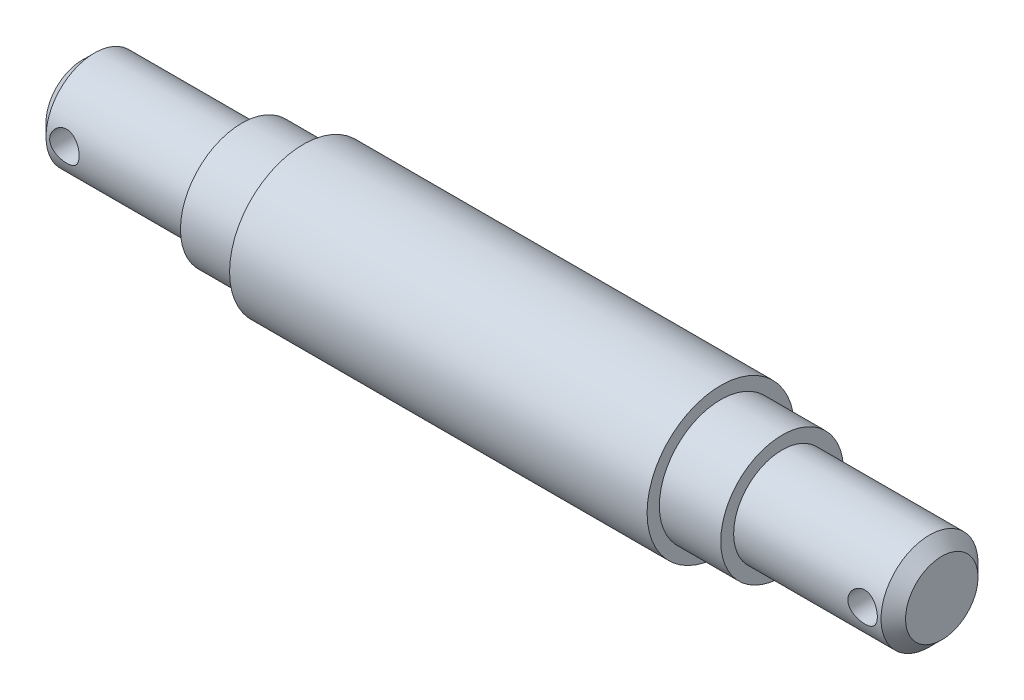
ISO-10303-21;
HEADER;
FILE_DESCRIPTION(('STEP AP214'),'2;1');
FILE_NAME('part.step','',(''),(''),'','','');
FILE_SCHEMA(('AUTOMOTIVE_DESIGN { 1 0 10303 214 1 1 1 1 }'));
ENDSEC;
DATA;
#1=APPLICATION_CONTEXT('core data for automotive mechanical design processes');
#2=APPLICATION_PROTOCOL_DEFINITION('international standard','automotive_design',2000,#1);
#3=PRODUCT_CONTEXT('',#1,'mechanical');
#4=PRODUCT('Part','Part','',(#3));
#5=PRODUCT_RELATED_PRODUCT_CATEGORY('part','',(#4));
#6=PRODUCT_DEFINITION_FORMATION('','',#4);
#7=PRODUCT_DEFINITION_CONTEXT('part definition',#1,'design');
#8=PRODUCT_DEFINITION('design','',#6,#7);
#9=PRODUCT_DEFINITION_SHAPE('','',#8);
#10=(LENGTH_UNIT() NAMED_UNIT(*) SI_UNIT(.MILLI.,.METRE.));
#11=(NAMED_UNIT(*) PLANE_ANGLE_UNIT() SI_UNIT($,.RADIAN.));
#12=(NAMED_UNIT(*) SI_UNIT($,.STERADIAN.) SOLID_ANGLE_UNIT());
#13=UNCERTAINTY_MEASURE_WITH_UNIT(LENGTH_MEASURE(1.E-05),#10,'distance_accuracy_value','');
#14=(GEOMETRIC_REPRESENTATION_CONTEXT(3) GLOBAL_UNCERTAINTY_ASSIGNED_CONTEXT((#13)) GLOBAL_UNIT_ASSIGNED_CONTEXT((#10,
#11,#12)) REPRESENTATION_CONTEXT('',''));
#15=CARTESIAN_POINT('',(0.,0.,0.));
#16=DIRECTION('',(0.,0.,1.));
#17=DIRECTION('',(1.,0.,0.));
#18=AXIS2_PLACEMENT_3D('',#15,#16,#17);
#19=CARTESIAN_POINT('',(0.,2.94999999999999,0.));
#20=DIRECTION('',(1.,0.,0.));
#21=DIRECTION('',(0.,0.,-1.));
#22=AXIS2_PLACEMENT_3D('',#19,#20,#21);
#23=PLANE('',#22);
#24=CARTESIAN_POINT('',(0.,0.,0.));
#25=DIRECTION('',(-1.,0.,0.));
#26=DIRECTION('',(0.,0.,1.));
#27=AXIS2_PLACEMENT_3D('',#24,#25,#26);
#28=CIRCLE('',#27,2.94999999999999);
#29=CARTESIAN_POINT('',(0.,0.,2.94999999999999));
#30=VERTEX_POINT('',#29);
#31=EDGE_CURVE('E121',#30,#30,#28,.T.);
#32=ORIENTED_EDGE('',*,*,#31,.T.);
#33=EDGE_LOOP('',(#32));
#34=FACE_BOUND('',#33,.T.);
#35=ADVANCED_FACE('F41',(#34),#23,.F.);
#36=CARTESIAN_POINT('',(70.,0.,0.));
#37=DIRECTION('',(-1.,0.,0.));
#38=DIRECTION('',(0.,0.,1.));
#39=AXIS2_PLACEMENT_3D('',#36,#37,#38);
#40=PLANE('',#39);
#41=CARTESIAN_POINT('',(70.,0.,0.));
#42=DIRECTION('',(-1.,0.,0.));
#43=DIRECTION('',(0.,0.,1.));
#44=AXIS2_PLACEMENT_3D('',#41,#42,#43);
#45=CIRCLE('',#44,2.95);
#46=CARTESIAN_POINT('',(70.,0.,2.95));
#47=VERTEX_POINT('',#46);
#48=EDGE_CURVE('E10',#47,#47,#45,.T.);
#49=ORIENTED_EDGE('',*,*,#48,.F.);
#50=EDGE_LOOP('',(#49));
#51=FACE_BOUND('',#50,.T.);
#52=ADVANCED_FACE('F109',(#51),#40,.F.);
#53=CARTESIAN_POINT('',(70.,0.,0.));
#54=DIRECTION('',(-1.,0.,0.));
#55=DIRECTION('',(0.,0.,1.));
#56=AXIS2_PLACEMENT_3D('',#53,#54,#55);
#57=CONICAL_SURFACE('',#56,2.95,0.785398163397448);
#58=CARTESIAN_POINT('',(69.,0.,0.));
#59=DIRECTION('',(-1.,0.,0.));
#60=DIRECTION('',(0.,0.,1.));
#61=AXIS2_PLACEMENT_3D('',#58,#59,#60);
#62=CIRCLE('',#61,3.95);
#63=CARTESIAN_POINT('',(69.,0.,3.95));
#64=VERTEX_POINT('',#63);
#65=EDGE_CURVE('E54',#64,#64,#62,.T.);
#66=ORIENTED_EDGE('',*,*,#65,.F.);
#67=EDGE_LOOP('',(#66));
#68=FACE_BOUND('',#67,.T.);
#69=ORIENTED_EDGE('',*,*,#48,.T.);
#70=EDGE_LOOP('',(#69));
#71=FACE_BOUND('',#70,.T.);
#72=ADVANCED_FACE('F104',(#68,#71),#57,.T.);
#73=CARTESIAN_POINT('',(0.,0.,0.));
#74=DIRECTION('',(-1.,0.,0.));
#75=DIRECTION('',(0.,0.,1.));
#76=AXIS2_PLACEMENT_3D('',#73,#74,#75);
#77=CYLINDRICAL_SURFACE('',#76,3.95);
#78=CARTESIAN_POINT('',(68.7,0.,3.95));
#79=CARTESIAN_POINT('',(68.699999309067,-0.0657921053393096,3.94999950148961));
#80=CARTESIAN_POINT('',(68.6945713423082,-0.131591214838203,3.94834057311497));
#81=CARTESIAN_POINT('',(68.6730560327882,-0.261270865350392,3.94188498697175));
#82=CARTESIAN_POINT('',(68.6569657419196,-0.325150870627958,3.93708746139313));
#83=CARTESIAN_POINT('',(68.6147143702164,-0.449103270402122,3.92487988296748));
#84=CARTESIAN_POINT('',(68.5885683676363,-0.509181209664437,3.91747374305666));
#85=CARTESIAN_POINT('',(68.5270102908556,-0.624100282433899,3.90081718663398));
#86=CARTESIAN_POINT('',(68.4915969145227,-0.678940678549645,3.89156651099519));
#87=CARTESIAN_POINT('',(68.4114139294501,-0.783438437222784,3.87190239177238));
#88=CARTESIAN_POINT('',(68.3664216080813,-0.832920325244443,3.86146466337096));
#89=CARTESIAN_POINT('',(68.2688324305187,-0.923765255505192,3.84074643294284));
#90=CARTESIAN_POINT('',(68.2162342575259,-0.965126888957126,3.83046595848297));
#91=CARTESIAN_POINT('',(68.1034313998918,-1.03948900030353,3.81096820781043));
#92=CARTESIAN_POINT('',(68.0430788331166,-1.07227379069014,3.80178104820254));
#93=CARTESIAN_POINT('',(67.9173927923664,-1.12715664878845,3.78587377700204));
#94=CARTESIAN_POINT('',(67.8520605536529,-1.14925735687915,3.77915305597243));
#95=CARTESIAN_POINT('',(67.7202430842059,-1.18150913793118,3.76919296296908));
#96=CARTESIAN_POINT('',(67.6538444632701,-1.19198431895655,3.76585939822971));
#97=CARTESIAN_POINT('',(67.5201549851538,-1.20169991107967,3.76277100880303));
#98=CARTESIAN_POINT('',(67.4528643545652,-1.20094312272632,3.76301529202458));
#99=CARTESIAN_POINT('',(67.3219501570623,-1.1884705081571,3.76697161773738));
#100=CARTESIAN_POINT('',(67.2582831860542,-1.17716250700933,3.7705546058486));
#101=CARTESIAN_POINT('',(67.1337964711495,-1.14456806673587,3.78057558453502));
#102=CARTESIAN_POINT('',(67.0729770153932,-1.12328062017983,3.7870138633498));
#103=CARTESIAN_POINT('',(66.9549220552885,-1.07103490290146,3.80212175360936));
#104=CARTESIAN_POINT('',(66.8977485195439,-1.03994563160966,3.81082129239325));
#105=CARTESIAN_POINT('',(66.7892941375805,-0.969069803090077,3.82945730084039));
#106=CARTESIAN_POINT('',(66.7380147553671,-0.929281092164124,3.8393940765405));
#107=CARTESIAN_POINT('',(66.6404934453549,-0.840117660833644,3.85990662941459));
#108=CARTESIAN_POINT('',(66.594561848265,-0.790405027053219,3.87049153542939));
#109=CARTESIAN_POINT('',(66.5116141422669,-0.683850928056176,3.8907306221033));
#110=CARTESIAN_POINT('',(66.474598623408,-0.627008991414062,3.90038474113935));
#111=CARTESIAN_POINT('',(66.4103388738867,-0.507235607809575,3.91776652995739));
#112=CARTESIAN_POINT('',(66.3831650382018,-0.444264225815952,3.92548020503653));
#113=CARTESIAN_POINT('',(66.3398862787667,-0.314356032727516,3.93801108754001));
#114=CARTESIAN_POINT('',(66.3237781858395,-0.247420362956473,3.94282912421219));
#115=CARTESIAN_POINT('',(66.3036084028364,-0.114120636053963,3.94889402423303));
#116=CARTESIAN_POINT('',(66.2991262681458,-0.0478257706931099,3.95026547137128));
#117=CARTESIAN_POINT('',(66.3011550878346,0.0845739664892645,3.94964905795108));
#118=CARTESIAN_POINT('',(66.3076645335288,0.150678863138067,3.94766165842204));
#119=CARTESIAN_POINT('',(66.3311524846441,0.279224843718509,3.94063250926792));
#120=CARTESIAN_POINT('',(66.3478839633591,0.341715383064576,3.93566287748284));
#121=CARTESIAN_POINT('',(66.3910425635287,0.46298751214422,3.9232462867588));
#122=CARTESIAN_POINT('',(66.4174708608141,0.521768651064515,3.91579902739437));
#123=CARTESIAN_POINT('',(66.4799699305355,0.635489778460965,3.89897895098375));
#124=CARTESIAN_POINT('',(66.5162528662978,0.690306912058737,3.88956496603778));
#125=CARTESIAN_POINT('',(66.5971744514623,0.793217107200196,3.86989097410411));
#126=CARTESIAN_POINT('',(66.6418152473686,0.841308435836415,3.85963075016098));
#127=CARTESIAN_POINT('',(66.7401615057773,0.93126219472894,3.8389403158374));
#128=CARTESIAN_POINT('',(66.7941430083754,0.972825315903959,3.82851804368209));
#129=CARTESIAN_POINT('',(66.9085410089933,1.04632580306949,3.8090881755083));
#130=CARTESIAN_POINT('',(66.9689573565118,1.07826339411975,3.80008054641565));
#131=CARTESIAN_POINT('',(67.0943366498449,1.13139313809661,3.78460257028509));
#132=CARTESIAN_POINT('',(67.1592778979753,1.15263302867236,3.77812098085674));
#133=CARTESIAN_POINT('',(67.2920499847157,1.18380847718295,3.76847037643667));
#134=CARTESIAN_POINT('',(67.3598797919581,1.1937480353996,3.76530018925136));
#135=CARTESIAN_POINT('',(67.4933883668788,1.20176405179564,3.76274882724403));
#136=CARTESIAN_POINT('',(67.559035178016,1.20032934218194,3.76321151382289));
#137=CARTESIAN_POINT('',(67.6891050998603,1.18680835860972,3.76749719259433));
#138=CARTESIAN_POINT('',(67.7535282618118,1.17472253171075,3.77132004375065));
#139=CARTESIAN_POINT('',(67.8785005993841,1.14056150948796,3.78178924861813));
#140=CARTESIAN_POINT('',(67.9390893895407,1.11861887679372,3.7883980639779));
#141=CARTESIAN_POINT('',(68.0557739216337,1.06547063438702,3.80368682812306));
#142=CARTESIAN_POINT('',(68.1118687842014,1.03426321734227,3.81236718094976));
#143=CARTESIAN_POINT('',(68.2202335502225,0.962110752635529,3.83122441855044));
#144=CARTESIAN_POINT('',(68.2722831917953,0.920846329538665,3.84144499898209));
#145=CARTESIAN_POINT('',(68.3688776312579,0.830322181374974,3.86202232713825));
#146=CARTESIAN_POINT('',(68.4134204581551,0.781060363153478,3.872379109857));
#147=CARTESIAN_POINT('',(68.4950812638234,0.674145848788934,3.89243751616363));
#148=CARTESIAN_POINT('',(68.5319339365529,0.61628443568486,3.90210985106116));
#149=CARTESIAN_POINT('',(68.5953376113773,0.494893212202996,3.91935319911683));
#150=CARTESIAN_POINT('',(68.6218932042363,0.431365943417147,3.92692514826385));
#151=CARTESIAN_POINT('',(68.6617030372843,0.307034616834357,3.93849330935894));
#152=CARTESIAN_POINT('',(68.6760247532901,0.246597141950737,3.94277212268363));
#153=CARTESIAN_POINT('',(68.6951727192245,0.124108329921254,3.94852545465588));
#154=CARTESIAN_POINT('',(68.7000006517108,0.062057280720298,3.95000047021142));
#155=CARTESIAN_POINT('',(68.7,0.,3.95));
#156=B_SPLINE_CURVE_WITH_KNOTS('',3,(#78,#79,#80,#81,#82,#83,#84,#85,#86,#87,#88,#89,#90,#91,
#92,#93,#94,#95,#96,#97,#98,#99,#100,#101,#102,#103,#104,#105,#106,#107,#108,#109,#110,#111,
#112,#113,#114,#115,#116,#117,#118,#119,#120,#121,#122,#123,#124,#125,#126,#127,#128,#129,#130,
#131,#132,#133,#134,#135,#136,#137,#138,#139,#140,#141,#142,#143,#144,#145,#146,#147,#148,#149,
#150,#151,#152,#153,#154,#155),.UNSPECIFIED.,.T.,.F.,(4,2,2,2,2,2,2,2,2,2,2,2,2,2,2,2,2,2,2,2,2,
2,2,2,2,2,2,2,2,2,2,2,2,2,2,2,2,2,4),(0.,0.197148320035393,0.394351173873383,0.591259473294277,
0.788195454606485,0.990340802366868,1.19252118949644,1.3993812680836,1.60619019875129,
1.80707614853398,2.00791201079834,2.20129315930618,2.39469383394965,2.59079745889569,
2.78694968780097,2.99151370492323,3.19609125598954,3.40210447220442,3.6080586625695,
3.80645362401528,4.00482135632748,4.19857515486445,4.39235245564506,4.59068721838334,
4.78907298841319,4.9948598043899,5.20064180838011,5.40549720473314,5.61028006032374,
5.80631124083041,6.00233419370825,6.1957963245016,6.3892962198399,6.59000270555275,
6.790761807026,6.99759277849253,7.20433143185223,7.39032118612839,7.57627797496915),.UNSPECIFIED.);
#157=CARTESIAN_POINT('',(68.7,0.,3.95));
#158=VERTEX_POINT('',#157);
#159=EDGE_CURVE('E44',#158,#158,#156,.T.);
#160=ORIENTED_EDGE('',*,*,#159,.T.);
#161=EDGE_LOOP('',(#160));
#162=FACE_BOUND('',#161,.T.);
#163=CARTESIAN_POINT('',(68.7,0.,-3.95));
#164=CARTESIAN_POINT('',(68.699999309067,0.0657921053393096,-3.94999950148961));
#165=CARTESIAN_POINT('',(68.6945713423082,0.131591214838203,-3.94834057311497));
#166=CARTESIAN_POINT('',(68.6730560327882,0.261270865350392,-3.94188498697175));
#167=CARTESIAN_POINT('',(68.6569657419196,0.325150870627958,-3.93708746139313));
#168=CARTESIAN_POINT('',(68.6147143702164,0.449103270402122,-3.92487988296748));
#169=CARTESIAN_POINT('',(68.5885683676363,0.509181209664437,-3.91747374305666));
#170=CARTESIAN_POINT('',(68.5270102908556,0.624100282433899,-3.90081718663398));
#171=CARTESIAN_POINT('',(68.4915969145227,0.678940678549645,-3.89156651099519));
#172=CARTESIAN_POINT('',(68.4114139294501,0.783438437222784,-3.87190239177238));
#173=CARTESIAN_POINT('',(68.3664216080813,0.832920325244443,-3.86146466337096));
#174=CARTESIAN_POINT('',(68.2688324305187,0.923765255505192,-3.84074643294284));
#175=CARTESIAN_POINT('',(68.2162342575259,0.965126888957126,-3.83046595848297));
#176=CARTESIAN_POINT('',(68.1034313998918,1.03948900030353,-3.81096820781043));
#177=CARTESIAN_POINT('',(68.0430788331166,1.07227379069014,-3.80178104820254));
#178=CARTESIAN_POINT('',(67.9173927923664,1.12715664878845,-3.78587377700204));
#179=CARTESIAN_POINT('',(67.8520605536529,1.14925735687915,-3.77915305597243));
#180=CARTESIAN_POINT('',(67.7202430842059,1.18150913793118,-3.76919296296908));
#181=CARTESIAN_POINT('',(67.6538444632701,1.19198431895655,-3.76585939822971));
#182=CARTESIAN_POINT('',(67.5201549851538,1.20169991107967,-3.76277100880303));
#183=CARTESIAN_POINT('',(67.4528643545652,1.20094312272632,-3.76301529202458));
#184=CARTESIAN_POINT('',(67.3219501570623,1.1884705081571,-3.76697161773738));
#185=CARTESIAN_POINT('',(67.2582831860542,1.17716250700933,-3.7705546058486));
#186=CARTESIAN_POINT('',(67.1337964711495,1.14456806673587,-3.78057558453502));
#187=CARTESIAN_POINT('',(67.0729770153932,1.12328062017983,-3.7870138633498));
#188=CARTESIAN_POINT('',(66.9549220552885,1.07103490290146,-3.80212175360936));
#189=CARTESIAN_POINT('',(66.8977485195439,1.03994563160966,-3.81082129239325));
#190=CARTESIAN_POINT('',(66.7892941375805,0.969069803090077,-3.82945730084039));
#191=CARTESIAN_POINT('',(66.7380147553671,0.929281092164124,-3.8393940765405));
#192=CARTESIAN_POINT('',(66.6404934453549,0.840117660833644,-3.85990662941459));
#193=CARTESIAN_POINT('',(66.594561848265,0.790405027053219,-3.87049153542939));
#194=CARTESIAN_POINT('',(66.5116141422669,0.683850928056176,-3.8907306221033));
#195=CARTESIAN_POINT('',(66.474598623408,0.627008991414062,-3.90038474113935));
#196=CARTESIAN_POINT('',(66.4103388738867,0.507235607809575,-3.91776652995739));
#197=CARTESIAN_POINT('',(66.3831650382018,0.444264225815952,-3.92548020503653));
#198=CARTESIAN_POINT('',(66.3398862787667,0.314356032727516,-3.93801108754001));
#199=CARTESIAN_POINT('',(66.3237781858395,0.247420362956473,-3.94282912421219));
#200=CARTESIAN_POINT('',(66.3036084028364,0.114120636053963,-3.94889402423303));
#201=CARTESIAN_POINT('',(66.2991262681458,0.0478257706931099,-3.95026547137128));
#202=CARTESIAN_POINT('',(66.3011550878346,-0.0845739664892645,-3.94964905795108));
#203=CARTESIAN_POINT('',(66.3076645335288,-0.150678863138067,-3.94766165842204));
#204=CARTESIAN_POINT('',(66.3311524846441,-0.279224843718509,-3.94063250926792));
#205=CARTESIAN_POINT('',(66.3478839633591,-0.341715383064576,-3.93566287748284));
#206=CARTESIAN_POINT('',(66.3910425635287,-0.46298751214422,-3.9232462867588));
#207=CARTESIAN_POINT('',(66.4174708608141,-0.521768651064515,-3.91579902739437));
#208=CARTESIAN_POINT('',(66.4799699305355,-0.635489778460965,-3.89897895098375));
#209=CARTESIAN_POINT('',(66.5162528662978,-0.690306912058737,-3.88956496603778));
#210=CARTESIAN_POINT('',(66.5971744514623,-0.793217107200196,-3.86989097410411));
#211=CARTESIAN_POINT('',(66.6418152473686,-0.841308435836415,-3.85963075016098));
#212=CARTESIAN_POINT('',(66.7401615057773,-0.93126219472894,-3.8389403158374));
#213=CARTESIAN_POINT('',(66.7941430083754,-0.972825315903959,-3.82851804368209));
#214=CARTESIAN_POINT('',(66.9085410089933,-1.04632580306949,-3.8090881755083));
#215=CARTESIAN_POINT('',(66.9689573565118,-1.07826339411975,-3.80008054641565));
#216=CARTESIAN_POINT('',(67.0943366498449,-1.13139313809661,-3.78460257028509));
#217=CARTESIAN_POINT('',(67.1592778979753,-1.15263302867236,-3.77812098085674));
#218=CARTESIAN_POINT('',(67.2920499847157,-1.18380847718295,-3.76847037643667));
#219=CARTESIAN_POINT('',(67.3598797919581,-1.1937480353996,-3.76530018925136));
#220=CARTESIAN_POINT('',(67.4933883668788,-1.20176405179564,-3.76274882724403));
#221=CARTESIAN_POINT('',(67.559035178016,-1.20032934218194,-3.76321151382289));
#222=CARTESIAN_POINT('',(67.6891050998603,-1.18680835860972,-3.76749719259433));
#223=CARTESIAN_POINT('',(67.7535282618118,-1.17472253171075,-3.77132004375065));
#224=CARTESIAN_POINT('',(67.8785005993841,-1.14056150948796,-3.78178924861813));
#225=CARTESIAN_POINT('',(67.9390893895407,-1.11861887679372,-3.7883980639779));
#226=CARTESIAN_POINT('',(68.0557739216337,-1.06547063438702,-3.80368682812306));
#227=CARTESIAN_POINT('',(68.1118687842014,-1.03426321734227,-3.81236718094976));
#228=CARTESIAN_POINT('',(68.2202335502225,-0.962110752635529,-3.83122441855044));
#229=CARTESIAN_POINT('',(68.2722831917953,-0.920846329538665,-3.84144499898209));
#230=CARTESIAN_POINT('',(68.3688776312579,-0.830322181374974,-3.86202232713825));
#231=CARTESIAN_POINT('',(68.4134204581551,-0.781060363153478,-3.872379109857));
#232=CARTESIAN_POINT('',(68.4950812638234,-0.674145848788934,-3.89243751616363));
#233=CARTESIAN_POINT('',(68.5319339365529,-0.61628443568486,-3.90210985106116));
#234=CARTESIAN_POINT('',(68.5953376113773,-0.494893212202996,-3.91935319911683));
#235=CARTESIAN_POINT('',(68.6218932042363,-0.431365943417147,-3.92692514826385));
#236=CARTESIAN_POINT('',(68.6617030372843,-0.307034616834357,-3.93849330935894));
#237=CARTESIAN_POINT('',(68.6760247532901,-0.246597141950737,-3.94277212268363));
#238=CARTESIAN_POINT('',(68.6951727192245,-0.124108329921254,-3.94852545465588));
#239=CARTESIAN_POINT('',(68.7000006517108,-0.062057280720298,-3.95000047021142));
#240=CARTESIAN_POINT('',(68.7,0.,-3.95));
#241=B_SPLINE_CURVE_WITH_KNOTS('',3,(#163,#164,#165,#166,#167,#168,#169,#170,#171,#172,#173,
#174,#175,#176,#177,#178,#179,#180,#181,#182,#183,#184,#185,#186,#187,#188,#189,#190,#191,#192,
#193,#194,#195,#196,#197,#198,#199,#200,#201,#202,#203,#204,#205,#206,#207,#208,#209,#210,#211,
#212,#213,#214,#215,#216,#217,#218,#219,#220,#221,#222,#223,#224,#225,#226,#227,#228,#229,#230,
#231,#232,#233,#234,#235,#236,#237,#238,#239,#240),.UNSPECIFIED.,.T.,.F.,(4,2,2,2,2,2,2,2,2,2,2,
2,2,2,2,2,2,2,2,2,2,2,2,2,2,2,2,2,2,2,2,2,2,2,2,2,2,2,4),(0.,0.197148320035393,
0.394351173873383,0.591259473294277,0.788195454606485,0.990340802366868,1.19252118949644,
1.3993812680836,1.60619019875129,1.80707614853398,2.00791201079834,2.20129315930618,
2.39469383394965,2.59079745889569,2.78694968780097,2.99151370492323,3.19609125598954,
3.40210447220442,3.6080586625695,3.80645362401528,4.00482135632748,4.19857515486445,
4.39235245564506,4.59068721838334,4.78907298841319,4.9948598043899,5.20064180838011,
5.40549720473314,5.61028006032374,5.80631124083041,6.00233419370825,6.1957963245016,
6.3892962198399,6.59000270555275,6.790761807026,6.99759277849253,7.20433143185223,
7.39032118612839,7.57627797496915),.UNSPECIFIED.);
#242=CARTESIAN_POINT('',(68.7,0.,-3.95));
#243=VERTEX_POINT('',#242);
#244=EDGE_CURVE('E92',#243,#243,#241,.T.);
#245=ORIENTED_EDGE('',*,*,#244,.T.);
#246=EDGE_LOOP('',(#245));
#247=FACE_BOUND('',#246,.T.);
#248=CARTESIAN_POINT('',(57.,0.,0.));
#249=DIRECTION('',(-1.,0.,0.));
#250=DIRECTION('',(0.,0.,1.));
#251=AXIS2_PLACEMENT_3D('',#248,#249,#250);
#252=CIRCLE('',#251,3.95);
#253=CARTESIAN_POINT('',(57.,0.,3.95));
#254=VERTEX_POINT('',#253);
#255=EDGE_CURVE('E60',#254,#254,#252,.T.);
#256=ORIENTED_EDGE('',*,*,#255,.F.);
#257=EDGE_LOOP('',(#256));
#258=FACE_BOUND('',#257,.T.);
#259=ORIENTED_EDGE('',*,*,#65,.T.);
#260=EDGE_LOOP('',(#259));
#261=FACE_BOUND('',#260,.T.);
#262=ADVANCED_FACE('F98',(#162,#247,#258,#261),#77,.T.);
#263=CARTESIAN_POINT('',(57.,3.95,0.));
#264=DIRECTION('',(-1.,0.,0.));
#265=DIRECTION('',(0.,0.,1.));
#266=AXIS2_PLACEMENT_3D('',#263,#264,#265);
#267=PLANE('',#266);
#268=CARTESIAN_POINT('',(57.,0.,0.));
#269=DIRECTION('',(-1.,0.,0.));
#270=DIRECTION('',(0.,0.,1.));
#271=AXIS2_PLACEMENT_3D('',#268,#269,#270);
#272=CIRCLE('',#271,5.00000000000001);
#273=CARTESIAN_POINT('',(57.,0.,5.00000000000001));
#274=VERTEX_POINT('',#273);
#275=EDGE_CURVE('E156',#274,#274,#272,.T.);
#276=ORIENTED_EDGE('',*,*,#275,.F.);
#277=EDGE_LOOP('',(#276));
#278=FACE_BOUND('',#277,.T.);
#279=ORIENTED_EDGE('',*,*,#255,.T.);
#280=EDGE_LOOP('',(#279));
#281=FACE_BOUND('',#280,.T.);
#282=ADVANCED_FACE('F103',(#278,#281),#267,.F.);
#283=CARTESIAN_POINT('',(0.,0.,0.));
#284=DIRECTION('',(-1.,0.,0.));
#285=DIRECTION('',(0.,0.,1.));
#286=AXIS2_PLACEMENT_3D('',#283,#284,#285);
#287=CYLINDRICAL_SURFACE('',#286,5.00000000000001);
#288=CARTESIAN_POINT('',(52.,0.,0.));
#289=DIRECTION('',(-1.,0.,0.));
#290=DIRECTION('',(0.,0.,1.));
#291=AXIS2_PLACEMENT_3D('',#288,#289,#290);
#292=CIRCLE('',#291,5.00000000000001);
#293=CARTESIAN_POINT('',(52.,0.,5.00000000000001));
#294=VERTEX_POINT('',#293);
#295=EDGE_CURVE('E152',#294,#294,#292,.T.);
#296=ORIENTED_EDGE('',*,*,#295,.F.);
#297=EDGE_LOOP('',(#296));
#298=FACE_BOUND('',#297,.T.);
#299=ORIENTED_EDGE('',*,*,#275,.T.);
#300=EDGE_LOOP('',(#299));
#301=FACE_BOUND('',#300,.T.);
#302=ADVANCED_FACE('F167',(#298,#301),#287,.T.);
#303=CARTESIAN_POINT('',(52.,5.00000000000001,0.));
#304=DIRECTION('',(-1.,0.,0.));
#305=DIRECTION('',(0.,0.,1.));
#306=AXIS2_PLACEMENT_3D('',#303,#304,#305);
#307=PLANE('',#306);
#308=CARTESIAN_POINT('',(52.,0.,0.));
#309=DIRECTION('',(-1.,0.,0.));
#310=DIRECTION('',(0.,0.,1.));
#311=AXIS2_PLACEMENT_3D('',#308,#309,#310);
#312=CIRCLE('',#311,6.);
#313=CARTESIAN_POINT('',(52.,0.,6.));
#314=VERTEX_POINT('',#313);
#315=EDGE_CURVE('E148',#314,#314,#312,.T.);
#316=ORIENTED_EDGE('',*,*,#315,.F.);
#317=EDGE_LOOP('',(#316));
#318=FACE_BOUND('',#317,.T.);
#319=ORIENTED_EDGE('',*,*,#295,.T.);
#320=EDGE_LOOP('',(#319));
#321=FACE_BOUND('',#320,.T.);
#322=ADVANCED_FACE('F172',(#318,#321),#307,.F.);
#323=CARTESIAN_POINT('',(0.,0.,0.));
#324=DIRECTION('',(-1.,0.,0.));
#325=DIRECTION('',(0.,0.,1.));
#326=AXIS2_PLACEMENT_3D('',#323,#324,#325);
#327=CYLINDRICAL_SURFACE('',#326,6.);
#328=CARTESIAN_POINT('',(18.,0.,0.));
#329=DIRECTION('',(-1.,0.,0.));
#330=DIRECTION('',(0.,0.,1.));
#331=AXIS2_PLACEMENT_3D('',#328,#329,#330);
#332=CIRCLE('',#331,6.);
#333=CARTESIAN_POINT('',(18.,0.,6.));
#334=VERTEX_POINT('',#333);
#335=EDGE_CURVE('E144',#334,#334,#332,.T.);
#336=ORIENTED_EDGE('',*,*,#335,.F.);
#337=EDGE_LOOP('',(#336));
#338=FACE_BOUND('',#337,.T.);
#339=ORIENTED_EDGE('',*,*,#315,.T.);
#340=EDGE_LOOP('',(#339));
#341=FACE_BOUND('',#340,.T.);
#342=ADVANCED_FACE('F179',(#338,#341),#327,.T.);
#343=CARTESIAN_POINT('',(18.,6.,0.));
#344=DIRECTION('',(1.,0.,0.));
#345=DIRECTION('',(0.,0.,-1.));
#346=AXIS2_PLACEMENT_3D('',#343,#344,#345);
#347=PLANE('',#346);
#348=CARTESIAN_POINT('',(18.,0.,0.));
#349=DIRECTION('',(-1.,0.,0.));
#350=DIRECTION('',(0.,0.,1.));
#351=AXIS2_PLACEMENT_3D('',#348,#349,#350);
#352=CIRCLE('',#351,5.);
#353=CARTESIAN_POINT('',(18.,0.,5.));
#354=VERTEX_POINT('',#353);
#355=EDGE_CURVE('E140',#354,#354,#352,.T.);
#356=ORIENTED_EDGE('',*,*,#355,.F.);
#357=EDGE_LOOP('',(#356));
#358=FACE_BOUND('',#357,.T.);
#359=ORIENTED_EDGE('',*,*,#335,.T.);
#360=EDGE_LOOP('',(#359));
#361=FACE_BOUND('',#360,.T.);
#362=ADVANCED_FACE('F186',(#358,#361),#347,.F.);
#363=CARTESIAN_POINT('',(0.,0.,0.));
#364=DIRECTION('',(-1.,0.,0.));
#365=DIRECTION('',(0.,0.,1.));
#366=AXIS2_PLACEMENT_3D('',#363,#364,#365);
#367=CYLINDRICAL_SURFACE('',#366,5.);
#368=CARTESIAN_POINT('',(13.,0.,0.));
#369=DIRECTION('',(-1.,0.,0.));
#370=DIRECTION('',(0.,0.,1.));
#371=AXIS2_PLACEMENT_3D('',#368,#369,#370);
#372=CIRCLE('',#371,5.);
#373=CARTESIAN_POINT('',(13.,0.,5.));
#374=VERTEX_POINT('',#373);
#375=EDGE_CURVE('E136',#374,#374,#372,.T.);
#376=ORIENTED_EDGE('',*,*,#375,.F.);
#377=EDGE_LOOP('',(#376));
#378=FACE_BOUND('',#377,.T.);
#379=ORIENTED_EDGE('',*,*,#355,.T.);
#380=EDGE_LOOP('',(#379));
#381=FACE_BOUND('',#380,.T.);
#382=ADVANCED_FACE('F190',(#378,#381),#367,.T.);
#383=CARTESIAN_POINT('',(13.,5.,0.));
#384=DIRECTION('',(1.,0.,0.));
#385=DIRECTION('',(0.,0.,-1.));
#386=AXIS2_PLACEMENT_3D('',#383,#384,#385);
#387=PLANE('',#386);
#388=CARTESIAN_POINT('',(13.,0.,0.));
#389=DIRECTION('',(-1.,0.,0.));
#390=DIRECTION('',(0.,0.,1.));
#391=AXIS2_PLACEMENT_3D('',#388,#389,#390);
#392=CIRCLE('',#391,3.94999999999999);
#393=CARTESIAN_POINT('',(13.,0.,3.94999999999999));
#394=VERTEX_POINT('',#393);
#395=EDGE_CURVE('E129',#394,#394,#392,.T.);
#396=ORIENTED_EDGE('',*,*,#395,.F.);
#397=EDGE_LOOP('',(#396));
#398=FACE_BOUND('',#397,.T.);
#399=ORIENTED_EDGE('',*,*,#375,.T.);
#400=EDGE_LOOP('',(#399));
#401=FACE_BOUND('',#400,.T.);
#402=ADVANCED_FACE('F193',(#398,#401),#387,.F.);
#403=CARTESIAN_POINT('',(0.,0.,0.));
#404=DIRECTION('',(-1.,0.,0.));
#405=DIRECTION('',(0.,0.,1.));
#406=AXIS2_PLACEMENT_3D('',#403,#404,#405);
#407=CYLINDRICAL_SURFACE('',#406,3.94999999999999);
#408=CARTESIAN_POINT('',(3.7,0.,3.94999999999999));
#409=CARTESIAN_POINT('',(3.69999930906702,-0.0657921053393094,3.9499995014896));
#410=CARTESIAN_POINT('',(3.6945713423082,-0.131591214838203,3.94834057311496));
#411=CARTESIAN_POINT('',(3.67305603278821,-0.261270865350393,3.94188498697174));
#412=CARTESIAN_POINT('',(3.65696574191961,-0.325150870627959,3.93708746139313));
#413=CARTESIAN_POINT('',(3.61471437021637,-0.449103270402122,3.92487988296747));
#414=CARTESIAN_POINT('',(3.58856836763629,-0.509181209664437,3.91747374305665));
#415=CARTESIAN_POINT('',(3.52701029085556,-0.624100282433899,3.90081718663397));
#416=CARTESIAN_POINT('',(3.4915969145227,-0.678940678549646,3.89156651099519));
#417=CARTESIAN_POINT('',(3.41141392945013,-0.783438437222785,3.87190239177237));
#418=CARTESIAN_POINT('',(3.36642160808127,-0.832920325244444,3.86146466337096));
#419=CARTESIAN_POINT('',(3.26883243051874,-0.923765255505193,3.84074643294283));
#420=CARTESIAN_POINT('',(3.21623425752584,-0.965126888957126,3.83046595848296));
#421=CARTESIAN_POINT('',(3.10343139989179,-1.03948900030353,3.81096820781043));
#422=CARTESIAN_POINT('',(3.0430788331166,-1.07227379069014,3.80178104820254));
#423=CARTESIAN_POINT('',(2.91739279236636,-1.12715664878844,3.78587377700204));
#424=CARTESIAN_POINT('',(2.85206055365289,-1.14925735687915,3.77915305597242));
#425=CARTESIAN_POINT('',(2.72024308420593,-1.18150913793118,3.76919296296907));
#426=CARTESIAN_POINT('',(2.6538444632701,-1.19198431895655,3.7658593982297));
#427=CARTESIAN_POINT('',(2.5201549851538,-1.20169991107967,3.76277100880302));
#428=CARTESIAN_POINT('',(2.45286435456517,-1.20094312272632,3.76301529202457));
#429=CARTESIAN_POINT('',(2.32195015706233,-1.1884705081571,3.76697161773737));
#430=CARTESIAN_POINT('',(2.25828318605416,-1.17716250700933,3.77055460584859));
#431=CARTESIAN_POINT('',(2.13379647114954,-1.14456806673587,3.78057558453501));
#432=CARTESIAN_POINT('',(2.0729770153932,-1.12328062017983,3.78701386334979));
#433=CARTESIAN_POINT('',(1.95492205528855,-1.07103490290146,3.80212175360935));
#434=CARTESIAN_POINT('',(1.89774851954395,-1.03994563160967,3.81082129239324));
#435=CARTESIAN_POINT('',(1.78929413758052,-0.969069803090083,3.82945730084038));
#436=CARTESIAN_POINT('',(1.73801475536715,-0.929281092164126,3.83939407654049));
#437=CARTESIAN_POINT('',(1.64049344535495,-0.840117660833642,3.85990662941458));
#438=CARTESIAN_POINT('',(1.594561848265,-0.79040502705322,3.87049153542938));
#439=CARTESIAN_POINT('',(1.5116141422669,-0.683850928056176,3.89073062210329));
#440=CARTESIAN_POINT('',(1.474598623408,-0.62700899141406,3.90038474113934));
#441=CARTESIAN_POINT('',(1.4103388738867,-0.507235607809572,3.91776652995739));
#442=CARTESIAN_POINT('',(1.38316503820175,-0.44426422581595,3.92548020503652));
#443=CARTESIAN_POINT('',(1.33988627876673,-0.314356032727517,3.93801108754));
#444=CARTESIAN_POINT('',(1.32377818583953,-0.247420362956477,3.94282912421218));
#445=CARTESIAN_POINT('',(1.30360840283639,-0.114120636053968,3.94889402423302));
#446=CARTESIAN_POINT('',(1.29912626814583,-0.0478257706931131,3.95026547137127));
#447=CARTESIAN_POINT('',(1.30115508783461,0.0845739664892639,3.94964905795107));
#448=CARTESIAN_POINT('',(1.30766453352877,0.150678863138068,3.94766165842203));
#449=CARTESIAN_POINT('',(1.33115248464411,0.279224843718511,3.94063250926792));
#450=CARTESIAN_POINT('',(1.34788396335906,0.341715383064578,3.93566287748283));
#451=CARTESIAN_POINT('',(1.39104256352873,0.462987512144223,3.9232462867588));
#452=CARTESIAN_POINT('',(1.41747086081414,0.521768651064517,3.91579902739437));
#453=CARTESIAN_POINT('',(1.47996993053552,0.635489778460967,3.89897895098374));
#454=CARTESIAN_POINT('',(1.51625286629778,0.690306912058738,3.88956496603778));
#455=CARTESIAN_POINT('',(1.59717445146228,0.793217107200197,3.8698909741041));
#456=CARTESIAN_POINT('',(1.64181524736855,0.841308435836415,3.85963075016097));
#457=CARTESIAN_POINT('',(1.74016150577724,0.931262194728939,3.83894031583739));
#458=CARTESIAN_POINT('',(1.79414300837538,0.972825315903956,3.82851804368208));
#459=CARTESIAN_POINT('',(1.90854100899331,1.04632580306949,3.8090881755083));
#460=CARTESIAN_POINT('',(1.96895735651179,1.07826339411975,3.80008054641564));
#461=CARTESIAN_POINT('',(2.09433664984492,1.1313931380966,3.78460257028508));
#462=CARTESIAN_POINT('',(2.15927789797527,1.15263302867236,3.77812098085674));
#463=CARTESIAN_POINT('',(2.29204998471573,1.18380847718295,3.76847037643666));
#464=CARTESIAN_POINT('',(2.35987979195806,1.1937480353996,3.76530018925135));
#465=CARTESIAN_POINT('',(2.49338836687882,1.20176405179564,3.76274882724402));
#466=CARTESIAN_POINT('',(2.55903517801601,1.20032934218194,3.76321151382288));
#467=CARTESIAN_POINT('',(2.68910509986034,1.18680835860971,3.76749719259432));
#468=CARTESIAN_POINT('',(2.7535282618118,1.17472253171075,3.77132004375064));
#469=CARTESIAN_POINT('',(2.8785005993841,1.14056150948796,3.78178924861813));
#470=CARTESIAN_POINT('',(2.93908938954066,1.11861887679372,3.78839806397789));
#471=CARTESIAN_POINT('',(3.05577392163373,1.06547063438702,3.80368682812305));
#472=CARTESIAN_POINT('',(3.11186878420141,1.03426321734227,3.81236718094975));
#473=CARTESIAN_POINT('',(3.22023355022249,0.962110752635532,3.83122441855043));
#474=CARTESIAN_POINT('',(3.27228319179532,0.920846329538669,3.84144499898208));
#475=CARTESIAN_POINT('',(3.36887763125794,0.830322181374976,3.86202232713825));
#476=CARTESIAN_POINT('',(3.41342045815515,0.781060363153478,3.87237910985699));
#477=CARTESIAN_POINT('',(3.49508126382335,0.674145848788933,3.89243751616363));
#478=CARTESIAN_POINT('',(3.53193393655291,0.61628443568486,3.90210985106116));
#479=CARTESIAN_POINT('',(3.59533761137734,0.494893212202997,3.91935319911682));
#480=CARTESIAN_POINT('',(3.62189320423625,0.431365943417147,3.92692514826384));
#481=CARTESIAN_POINT('',(3.66170303728428,0.307034616834357,3.93849330935893));
#482=CARTESIAN_POINT('',(3.6760247532901,0.246597141950737,3.94277212268363));
#483=CARTESIAN_POINT('',(3.69517271922448,0.124108329921255,3.94852545465588));
#484=CARTESIAN_POINT('',(3.70000065171074,0.0620572807202984,3.95000047021141));
#485=CARTESIAN_POINT('',(3.7,0.,3.94999999999999));
#486=B_SPLINE_CURVE_WITH_KNOTS('',3,(#408,#409,#410,#411,#412,#413,#414,#415,#416,#417,#418,
#419,#420,#421,#422,#423,#424,#425,#426,#427,#428,#429,#430,#431,#432,#433,#434,#435,#436,#437,
#438,#439,#440,#441,#442,#443,#444,#445,#446,#447,#448,#449,#450,#451,#452,#453,#454,#455,#456,
#457,#458,#459,#460,#461,#462,#463,#464,#465,#466,#467,#468,#469,#470,#471,#472,#473,#474,#475,
#476,#477,#478,#479,#480,#481,#482,#483,#484,#485),.UNSPECIFIED.,.T.,.F.,(4,2,2,2,2,2,2,2,2,2,2,
2,2,2,2,2,2,2,2,2,2,2,2,2,2,2,2,2,2,2,2,2,2,2,2,2,2,2,4),(0.,0.197148320035392,
0.394351173873383,0.591259473294278,0.78819545460649,0.990340802366872,1.19252118949645,
1.39938126808359,1.60619019875128,1.80707614853398,2.00791201079835,2.20129315930618,
2.39469383394963,2.59079745889567,2.78694968780097,2.99151370492323,3.19609125598955,
3.40210447220442,3.6080586625695,3.80645362401528,4.00482135632748,4.19857515486445,
4.39235245564506,4.59068721838334,4.78907298841319,4.99485980438989,5.2006418083801,
5.40549720473314,5.61028006032374,5.80631124083042,6.00233419370823,6.19579632450157,
6.38929621983989,6.59000270555274,6.790761807026,6.99759277849253,7.20433143185223,
7.39032118612838,7.57627797496915),.UNSPECIFIED.);
#487=CARTESIAN_POINT('',(3.7,0.,3.94999999999999));
#488=VERTEX_POINT('',#487);
#489=EDGE_CURVE('E73',#488,#488,#486,.T.);
#490=ORIENTED_EDGE('',*,*,#489,.T.);
#491=EDGE_LOOP('',(#490));
#492=FACE_BOUND('',#491,.T.);
#493=CARTESIAN_POINT('',(3.7,0.,-3.94999999999999));
#494=CARTESIAN_POINT('',(3.69999930906702,0.0657921053393094,-3.9499995014896));
#495=CARTESIAN_POINT('',(3.6945713423082,0.131591214838203,-3.94834057311496));
#496=CARTESIAN_POINT('',(3.67305603278821,0.261270865350393,-3.94188498697174));
#497=CARTESIAN_POINT('',(3.65696574191961,0.325150870627959,-3.93708746139313));
#498=CARTESIAN_POINT('',(3.61471437021637,0.449103270402122,-3.92487988296747));
#499=CARTESIAN_POINT('',(3.58856836763629,0.509181209664437,-3.91747374305665));
#500=CARTESIAN_POINT('',(3.52701029085556,0.624100282433899,-3.90081718663397));
#501=CARTESIAN_POINT('',(3.4915969145227,0.678940678549646,-3.89156651099519));
#502=CARTESIAN_POINT('',(3.41141392945013,0.783438437222785,-3.87190239177237));
#503=CARTESIAN_POINT('',(3.36642160808127,0.832920325244444,-3.86146466337096));
#504=CARTESIAN_POINT('',(3.26883243051874,0.923765255505193,-3.84074643294283));
#505=CARTESIAN_POINT('',(3.21623425752584,0.965126888957126,-3.83046595848296));
#506=CARTESIAN_POINT('',(3.10343139989179,1.03948900030353,-3.81096820781043));
#507=CARTESIAN_POINT('',(3.0430788331166,1.07227379069014,-3.80178104820254));
#508=CARTESIAN_POINT('',(2.91739279236636,1.12715664878844,-3.78587377700204));
#509=CARTESIAN_POINT('',(2.85206055365289,1.14925735687915,-3.77915305597242));
#510=CARTESIAN_POINT('',(2.72024308420593,1.18150913793118,-3.76919296296907));
#511=CARTESIAN_POINT('',(2.6538444632701,1.19198431895655,-3.7658593982297));
#512=CARTESIAN_POINT('',(2.5201549851538,1.20169991107967,-3.76277100880302));
#513=CARTESIAN_POINT('',(2.45286435456517,1.20094312272632,-3.76301529202457));
#514=CARTESIAN_POINT('',(2.32195015706233,1.1884705081571,-3.76697161773737));
#515=CARTESIAN_POINT('',(2.25828318605416,1.17716250700933,-3.77055460584859));
#516=CARTESIAN_POINT('',(2.13379647114954,1.14456806673587,-3.78057558453501));
#517=CARTESIAN_POINT('',(2.0729770153932,1.12328062017983,-3.78701386334979));
#518=CARTESIAN_POINT('',(1.95492205528855,1.07103490290146,-3.80212175360935));
#519=CARTESIAN_POINT('',(1.89774851954395,1.03994563160967,-3.81082129239324));
#520=CARTESIAN_POINT('',(1.78929413758052,0.969069803090083,-3.82945730084038));
#521=CARTESIAN_POINT('',(1.73801475536715,0.929281092164126,-3.83939407654049));
#522=CARTESIAN_POINT('',(1.64049344535495,0.840117660833642,-3.85990662941458));
#523=CARTESIAN_POINT('',(1.594561848265,0.79040502705322,-3.87049153542938));
#524=CARTESIAN_POINT('',(1.5116141422669,0.683850928056176,-3.89073062210329));
#525=CARTESIAN_POINT('',(1.474598623408,0.62700899141406,-3.90038474113934));
#526=CARTESIAN_POINT('',(1.4103388738867,0.507235607809572,-3.91776652995739));
#527=CARTESIAN_POINT('',(1.38316503820175,0.44426422581595,-3.92548020503652));
#528=CARTESIAN_POINT('',(1.33988627876673,0.314356032727517,-3.93801108754));
#529=CARTESIAN_POINT('',(1.32377818583953,0.247420362956477,-3.94282912421218));
#530=CARTESIAN_POINT('',(1.30360840283639,0.114120636053968,-3.94889402423302));
#531=CARTESIAN_POINT('',(1.29912626814583,0.0478257706931131,-3.95026547137127));
#532=CARTESIAN_POINT('',(1.30115508783461,-0.0845739664892639,-3.94964905795107));
#533=CARTESIAN_POINT('',(1.30766453352877,-0.150678863138068,-3.94766165842203));
#534=CARTESIAN_POINT('',(1.33115248464411,-0.279224843718511,-3.94063250926792));
#535=CARTESIAN_POINT('',(1.34788396335906,-0.341715383064578,-3.93566287748283));
#536=CARTESIAN_POINT('',(1.39104256352873,-0.462987512144223,-3.9232462867588));
#537=CARTESIAN_POINT('',(1.41747086081414,-0.521768651064517,-3.91579902739437));
#538=CARTESIAN_POINT('',(1.47996993053552,-0.635489778460967,-3.89897895098374));
#539=CARTESIAN_POINT('',(1.51625286629778,-0.690306912058738,-3.88956496603778));
#540=CARTESIAN_POINT('',(1.59717445146228,-0.793217107200197,-3.8698909741041));
#541=CARTESIAN_POINT('',(1.64181524736855,-0.841308435836415,-3.85963075016097));
#542=CARTESIAN_POINT('',(1.74016150577724,-0.931262194728939,-3.83894031583739));
#543=CARTESIAN_POINT('',(1.79414300837538,-0.972825315903956,-3.82851804368208));
#544=CARTESIAN_POINT('',(1.90854100899331,-1.04632580306949,-3.8090881755083));
#545=CARTESIAN_POINT('',(1.96895735651179,-1.07826339411975,-3.80008054641564));
#546=CARTESIAN_POINT('',(2.09433664984492,-1.1313931380966,-3.78460257028508));
#547=CARTESIAN_POINT('',(2.15927789797527,-1.15263302867236,-3.77812098085674));
#548=CARTESIAN_POINT('',(2.29204998471573,-1.18380847718295,-3.76847037643666));
#549=CARTESIAN_POINT('',(2.35987979195806,-1.1937480353996,-3.76530018925135));
#550=CARTESIAN_POINT('',(2.49338836687882,-1.20176405179564,-3.76274882724402));
#551=CARTESIAN_POINT('',(2.55903517801601,-1.20032934218194,-3.76321151382288));
#552=CARTESIAN_POINT('',(2.68910509986034,-1.18680835860971,-3.76749719259432));
#553=CARTESIAN_POINT('',(2.7535282618118,-1.17472253171075,-3.77132004375064));
#554=CARTESIAN_POINT('',(2.8785005993841,-1.14056150948796,-3.78178924861813));
#555=CARTESIAN_POINT('',(2.93908938954066,-1.11861887679372,-3.78839806397789));
#556=CARTESIAN_POINT('',(3.05577392163373,-1.06547063438702,-3.80368682812305));
#557=CARTESIAN_POINT('',(3.11186878420141,-1.03426321734227,-3.81236718094975));
#558=CARTESIAN_POINT('',(3.22023355022249,-0.962110752635532,-3.83122441855043));
#559=CARTESIAN_POINT('',(3.27228319179532,-0.920846329538669,-3.84144499898208));
#560=CARTESIAN_POINT('',(3.36887763125794,-0.830322181374976,-3.86202232713825));
#561=CARTESIAN_POINT('',(3.41342045815515,-0.781060363153478,-3.87237910985699));
#562=CARTESIAN_POINT('',(3.49508126382335,-0.674145848788933,-3.89243751616363));
#563=CARTESIAN_POINT('',(3.53193393655291,-0.61628443568486,-3.90210985106116));
#564=CARTESIAN_POINT('',(3.59533761137734,-0.494893212202997,-3.91935319911682));
#565=CARTESIAN_POINT('',(3.62189320423625,-0.431365943417147,-3.92692514826384));
#566=CARTESIAN_POINT('',(3.66170303728428,-0.307034616834357,-3.93849330935893));
#567=CARTESIAN_POINT('',(3.6760247532901,-0.246597141950737,-3.94277212268363));
#568=CARTESIAN_POINT('',(3.69517271922448,-0.124108329921255,-3.94852545465588));
#569=CARTESIAN_POINT('',(3.70000065171074,-0.0620572807202984,-3.95000047021141));
#570=CARTESIAN_POINT('',(3.7,0.,-3.94999999999999));
#571=B_SPLINE_CURVE_WITH_KNOTS('',3,(#493,#494,#495,#496,#497,#498,#499,#500,#501,#502,#503,
#504,#505,#506,#507,#508,#509,#510,#511,#512,#513,#514,#515,#516,#517,#518,#519,#520,#521,#522,
#523,#524,#525,#526,#527,#528,#529,#530,#531,#532,#533,#534,#535,#536,#537,#538,#539,#540,#541,
#542,#543,#544,#545,#546,#547,#548,#549,#550,#551,#552,#553,#554,#555,#556,#557,#558,#559,#560,
#561,#562,#563,#564,#565,#566,#567,#568,#569,#570),.UNSPECIFIED.,.T.,.F.,(4,2,2,2,2,2,2,2,2,2,2,
2,2,2,2,2,2,2,2,2,2,2,2,2,2,2,2,2,2,2,2,2,2,2,2,2,2,2,4),(0.,0.197148320035392,
0.394351173873383,0.591259473294278,0.78819545460649,0.990340802366872,1.19252118949645,
1.39938126808359,1.60619019875128,1.80707614853398,2.00791201079835,2.20129315930618,
2.39469383394963,2.59079745889567,2.78694968780097,2.99151370492323,3.19609125598955,
3.40210447220442,3.6080586625695,3.80645362401528,4.00482135632748,4.19857515486445,
4.39235245564506,4.59068721838334,4.78907298841319,4.99485980438989,5.2006418083801,
5.40549720473314,5.61028006032374,5.80631124083042,6.00233419370823,6.19579632450157,
6.38929621983989,6.59000270555274,6.790761807026,6.99759277849253,7.20433143185223,
7.39032118612838,7.57627797496915),.UNSPECIFIED.);
#572=CARTESIAN_POINT('',(3.7,0.,-3.94999999999999));
#573=VERTEX_POINT('',#572);
#574=EDGE_CURVE('E64',#573,#573,#571,.T.);
#575=ORIENTED_EDGE('',*,*,#574,.T.);
#576=EDGE_LOOP('',(#575));
#577=FACE_BOUND('',#576,.T.);
#578=CARTESIAN_POINT('',(1.,0.,0.));
#579=DIRECTION('',(-1.,0.,0.));
#580=DIRECTION('',(0.,0.,1.));
#581=AXIS2_PLACEMENT_3D('',#578,#579,#580);
#582=CIRCLE('',#581,3.94999999999999);
#583=CARTESIAN_POINT('',(1.,0.,3.94999999999999));
#584=VERTEX_POINT('',#583);
#585=EDGE_CURVE('E124',#584,#584,#582,.T.);
#586=ORIENTED_EDGE('',*,*,#585,.F.);
#587=EDGE_LOOP('',(#586));
#588=FACE_BOUND('',#587,.T.);
#589=ORIENTED_EDGE('',*,*,#395,.T.);
#590=EDGE_LOOP('',(#589));
#591=FACE_BOUND('',#590,.T.);
#592=ADVANCED_FACE('F77',(#492,#577,#588,#591),#407,.T.);
#593=CARTESIAN_POINT('',(1.,0.,0.));
#594=DIRECTION('',(1.,0.,0.));
#595=DIRECTION('',(0.,0.,-1.));
#596=AXIS2_PLACEMENT_3D('',#593,#594,#595);
#597=CONICAL_SURFACE('',#596,3.94999999999999,0.785398163397448);
#598=ORIENTED_EDGE('',*,*,#31,.F.);
#599=EDGE_LOOP('',(#598));
#600=FACE_BOUND('',#599,.T.);
#601=ORIENTED_EDGE('',*,*,#585,.T.);
#602=EDGE_LOOP('',(#601));
#603=FACE_BOUND('',#602,.T.);
#604=ADVANCED_FACE('F85',(#600,#603),#597,.T.);
#605=CARTESIAN_POINT('',(2.5,0.,-6.));
#606=DIRECTION('',(0.,0.,1.));
#607=DIRECTION('',(1.,0.,0.));
#608=AXIS2_PLACEMENT_3D('',#605,#606,#607);
#609=CYLINDRICAL_SURFACE('',#608,1.2);
#610=ORIENTED_EDGE('',*,*,#574,.F.);
#611=EDGE_LOOP('',(#610));
#612=FACE_BOUND('',#611,.T.);
#613=ORIENTED_EDGE('',*,*,#489,.F.);
#614=EDGE_LOOP('',(#613));
#615=FACE_BOUND('',#614,.T.);
#616=ADVANCED_FACE('F81',(#612,#615),#609,.F.);
#617=CARTESIAN_POINT('',(67.5,0.,-6.));
#618=DIRECTION('',(0.,0.,1.));
#619=DIRECTION('',(1.,0.,0.));
#620=AXIS2_PLACEMENT_3D('',#617,#618,#619);
#621=CYLINDRICAL_SURFACE('',#620,1.2);
#622=ORIENTED_EDGE('',*,*,#244,.F.);
#623=EDGE_LOOP('',(#622));
#624=FACE_BOUND('',#623,.T.);
#625=ORIENTED_EDGE('',*,*,#159,.F.);
#626=EDGE_LOOP('',(#625));
#627=FACE_BOUND('',#626,.T.);
#628=ADVANCED_FACE('F84',(#624,#627),#621,.F.);
#629=CLOSED_SHELL('',(#35,#52,#72,#262,#282,#302,#322,#342,#362,#382,#402,#592,#604,#616,#628));
#630=MANIFOLD_SOLID_BREP('B2',#629);
#631=ADVANCED_BREP_SHAPE_REPRESENTATION('',(#18,#630),#14);
#632=SHAPE_DEFINITION_REPRESENTATION(#9,#631);
ENDSEC;
END-ISO-10303-21;
